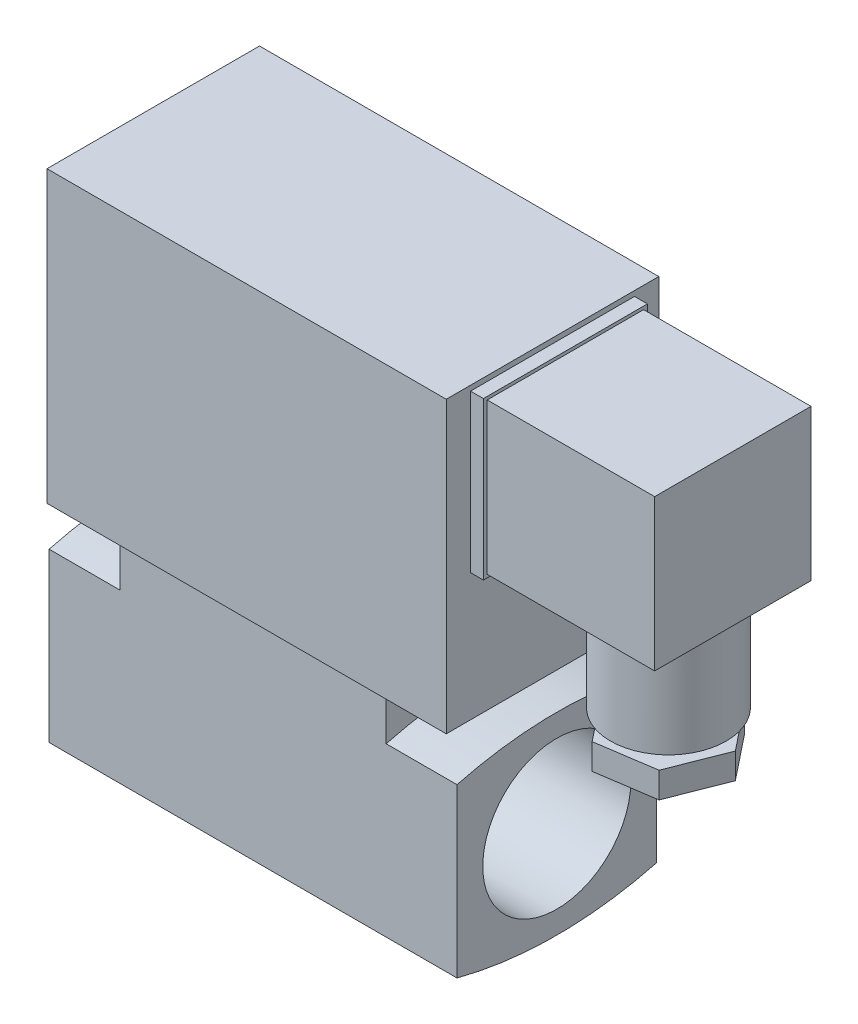
ISO-10303-21;
HEADER;
FILE_DESCRIPTION(('STEP AP214'),'2;1');
FILE_NAME('part.step','',(''),(''),'','','');
FILE_SCHEMA(('AUTOMOTIVE_DESIGN { 1 0 10303 214 1 1 1 1 }'));
ENDSEC;
DATA;
#1=APPLICATION_CONTEXT('core data for automotive mechanical design processes');
#2=APPLICATION_PROTOCOL_DEFINITION('international standard','automotive_design',2000,#1);
#3=PRODUCT_CONTEXT('',#1,'mechanical');
#4=PRODUCT('Part','Part','',(#3));
#5=PRODUCT_RELATED_PRODUCT_CATEGORY('part','',(#4));
#6=PRODUCT_DEFINITION_FORMATION('','',#4);
#7=PRODUCT_DEFINITION_CONTEXT('part definition',#1,'design');
#8=PRODUCT_DEFINITION('design','',#6,#7);
#9=PRODUCT_DEFINITION_SHAPE('','',#8);
#10=(LENGTH_UNIT() NAMED_UNIT(*) SI_UNIT(.MILLI.,.METRE.));
#11=(NAMED_UNIT(*) PLANE_ANGLE_UNIT() SI_UNIT($,.RADIAN.));
#12=(NAMED_UNIT(*) SI_UNIT($,.STERADIAN.) SOLID_ANGLE_UNIT());
#13=UNCERTAINTY_MEASURE_WITH_UNIT(LENGTH_MEASURE(1.E-05),#10,'distance_accuracy_value','');
#14=(GEOMETRIC_REPRESENTATION_CONTEXT(3) GLOBAL_UNCERTAINTY_ASSIGNED_CONTEXT((#13)) GLOBAL_UNIT_ASSIGNED_CONTEXT((#10,
#11,#12)) REPRESENTATION_CONTEXT('',''));
#15=CARTESIAN_POINT('',(0.,0.,0.));
#16=DIRECTION('',(0.,0.,1.));
#17=DIRECTION('',(1.,0.,0.));
#18=AXIS2_PLACEMENT_3D('',#15,#16,#17);
#19=CARTESIAN_POINT('',(-0.666821955000382,0.,0.));
#20=DIRECTION('',(1.,0.,0.));
#21=DIRECTION('',(0.,0.,-1.));
#22=AXIS2_PLACEMENT_3D('',#19,#20,#21);
#23=PLANE('',#22);
#24=CARTESIAN_POINT('',(-0.666821955000382,-65.,16.5));
#25=DIRECTION('',(1.,0.,0.));
#26=DIRECTION('',(0.,0.,-1.));
#27=AXIS2_PLACEMENT_3D('',#24,#25,#26);
#28=CIRCLE('',#27,11.5);
#29=CARTESIAN_POINT('',(-0.666821955000382,-65.,5.00000000000001));
#30=VERTEX_POINT('',#29);
#31=EDGE_CURVE('E786',#30,#30,#28,.F.);
#32=ORIENTED_EDGE('',*,*,#31,.F.);
#33=EDGE_LOOP('',(#32));
#34=FACE_BOUND('',#33,.T.);
#35=DIRECTION('',(0.,1.,0.));
#36=VECTOR('',#35,1.);
#37=CARTESIAN_POINT('',(-0.666821955000382,-80.,32.));
#38=LINE('',#37,#36);
#39=CARTESIAN_POINT('',(-0.666821955000382,-78.,32.));
#40=VERTEX_POINT('',#39);
#41=CARTESIAN_POINT('',(-0.666821955000382,-52.,32.));
#42=VERTEX_POINT('',#41);
#43=EDGE_CURVE('E280',#40,#42,#38,.T.);
#44=ORIENTED_EDGE('',*,*,#43,.T.);
#45=CARTESIAN_POINT('',(-0.666821955000382,-111.0625,16.5));
#46=DIRECTION('',(1.,0.,0.));
#47=DIRECTION('',(0.,0.,1.));
#48=AXIS2_PLACEMENT_3D('',#45,#46,#47);
#49=CIRCLE('',#48,61.0624999999997);
#50=CARTESIAN_POINT('',(-0.666821955000382,-52.,1.00000000000001));
#51=VERTEX_POINT('',#50);
#52=EDGE_CURVE('E249',#51,#42,#49,.T.);
#53=ORIENTED_EDGE('',*,*,#52,.F.);
#54=DIRECTION('',(0.,-1.,0.));
#55=VECTOR('',#54,1.);
#56=CARTESIAN_POINT('',(-0.666821955000382,-80.,1.00000000000001));
#57=LINE('',#56,#55);
#58=CARTESIAN_POINT('',(-0.666821955000382,-78.,1.00000000000002));
#59=VERTEX_POINT('',#58);
#60=EDGE_CURVE('E277',#51,#59,#57,.T.);
#61=ORIENTED_EDGE('',*,*,#60,.T.);
#62=CARTESIAN_POINT('',(-0.666821955000382,-18.937499999999,16.5));
#63=DIRECTION('',(1.,0.,0.));
#64=DIRECTION('',(0.,0.,-1.));
#65=AXIS2_PLACEMENT_3D('',#62,#63,#64);
#66=CIRCLE('',#65,61.062500000001);
#67=EDGE_CURVE('E260',#40,#59,#66,.T.);
#68=ORIENTED_EDGE('',*,*,#67,.F.);
#69=EDGE_LOOP('',(#44,#53,#61,#68));
#70=FACE_BOUND('',#69,.T.);
#71=ADVANCED_FACE('F35',(#34,#70),#23,.F.);
#72=CARTESIAN_POINT('',(62.6668219550004,0.,0.));
#73=DIRECTION('',(-1.,0.,0.));
#74=DIRECTION('',(0.,0.,1.));
#75=AXIS2_PLACEMENT_3D('',#72,#73,#74);
#76=PLANE('',#75);
#77=CARTESIAN_POINT('',(62.6668219550004,-65.,16.5));
#78=DIRECTION('',(1.,0.,0.));
#79=DIRECTION('',(0.,0.,-1.));
#80=AXIS2_PLACEMENT_3D('',#77,#78,#79);
#81=CIRCLE('',#80,11.5);
#82=CARTESIAN_POINT('',(62.6668219550004,-65.,5.00000000000001));
#83=VERTEX_POINT('',#82);
#84=EDGE_CURVE('E789',#83,#83,#81,.T.);
#85=ORIENTED_EDGE('',*,*,#84,.F.);
#86=EDGE_LOOP('',(#85));
#87=FACE_BOUND('',#86,.T.);
#88=DIRECTION('',(0.,1.,0.));
#89=VECTOR('',#88,1.);
#90=CARTESIAN_POINT('',(62.6668219550004,-80.,1.00000000000001));
#91=LINE('',#90,#89);
#92=CARTESIAN_POINT('',(62.6668219550004,-78.,1.00000000000001));
#93=VERTEX_POINT('',#92);
#94=CARTESIAN_POINT('',(62.6668219550004,-52.,1.00000000000001));
#95=VERTEX_POINT('',#94);
#96=EDGE_CURVE('E285',#93,#95,#91,.T.);
#97=ORIENTED_EDGE('',*,*,#96,.T.);
#98=CARTESIAN_POINT('',(62.6668219550004,-111.0625,16.5));
#99=DIRECTION('',(-1.,0.,0.));
#100=DIRECTION('',(0.,0.,-1.));
#101=AXIS2_PLACEMENT_3D('',#98,#99,#100);
#102=CIRCLE('',#101,61.0624999999999);
#103=CARTESIAN_POINT('',(62.6668219550004,-52.,32.));
#104=VERTEX_POINT('',#103);
#105=EDGE_CURVE('E263',#104,#95,#102,.T.);
#106=ORIENTED_EDGE('',*,*,#105,.F.);
#107=DIRECTION('',(0.,-1.,0.));
#108=VECTOR('',#107,1.);
#109=CARTESIAN_POINT('',(62.6668219550004,-80.,32.));
#110=LINE('',#109,#108);
#111=CARTESIAN_POINT('',(62.6668219550004,-78.,32.));
#112=VERTEX_POINT('',#111);
#113=EDGE_CURVE('E283',#104,#112,#110,.T.);
#114=ORIENTED_EDGE('',*,*,#113,.T.);
#115=CARTESIAN_POINT('',(62.6668219550004,-18.9374999999993,16.5));
#116=DIRECTION('',(-1.,0.,0.));
#117=DIRECTION('',(0.,0.,1.));
#118=AXIS2_PLACEMENT_3D('',#115,#116,#117);
#119=CIRCLE('',#118,61.0625000000007);
#120=EDGE_CURVE('E43',#112,#93,#119,.F.);
#121=ORIENTED_EDGE('',*,*,#120,.T.);
#122=EDGE_LOOP('',(#97,#106,#114,#121));
#123=FACE_BOUND('',#122,.T.);
#124=ADVANCED_FACE('F434',(#87,#123),#76,.F.);
#125=CARTESIAN_POINT('',(10.3331780449996,-80.,1.00000000000001));
#126=DIRECTION('',(1.,0.,0.));
#127=DIRECTION('',(0.,0.,-1.));
#128=AXIS2_PLACEMENT_3D('',#125,#126,#127);
#129=PLANE('',#128);
#130=DIRECTION('',(0.,1.,0.));
#131=VECTOR('',#130,1.);
#132=CARTESIAN_POINT('',(10.3331780449996,-80.,32.));
#133=LINE('',#132,#131);
#134=CARTESIAN_POINT('',(10.3331780449996,-52.,32.));
#135=VERTEX_POINT('',#134);
#136=CARTESIAN_POINT('',(10.3331780449996,-45.,32.));
#137=VERTEX_POINT('',#136);
#138=EDGE_CURVE('E302',#135,#137,#133,.T.);
#139=ORIENTED_EDGE('',*,*,#138,.T.);
#140=DIRECTION('',(0.,0.,-1.));
#141=VECTOR('',#140,1.);
#142=CARTESIAN_POINT('',(10.3331780449996,-45.,1.00000000000001));
#143=LINE('',#142,#141);
#144=CARTESIAN_POINT('',(10.3331780449996,-45.,1.00000000000001));
#145=VERTEX_POINT('',#144);
#146=EDGE_CURVE('E292',#137,#145,#143,.T.);
#147=ORIENTED_EDGE('',*,*,#146,.T.);
#148=DIRECTION('',(0.,1.,0.));
#149=VECTOR('',#148,1.);
#150=CARTESIAN_POINT('',(10.3331780449996,-80.,1.00000000000001));
#151=LINE('',#150,#149);
#152=CARTESIAN_POINT('',(10.3331780449996,-52.,1.00000000000002));
#153=VERTEX_POINT('',#152);
#154=EDGE_CURVE('E300',#153,#145,#151,.T.);
#155=ORIENTED_EDGE('',*,*,#154,.F.);
#156=CARTESIAN_POINT('',(10.3331780449996,-111.0625,16.5));
#157=DIRECTION('',(1.,0.,0.));
#158=DIRECTION('',(0.,0.,-1.));
#159=AXIS2_PLACEMENT_3D('',#156,#157,#158);
#160=CIRCLE('',#159,61.0624999999997);
#161=EDGE_CURVE('E252',#153,#135,#160,.T.);
#162=ORIENTED_EDGE('',*,*,#161,.T.);
#163=EDGE_LOOP('',(#139,#147,#155,#162));
#164=FACE_BOUND('',#163,.T.);
#165=ADVANCED_FACE('F440',(#164),#129,.F.);
#166=CARTESIAN_POINT('',(51.6668219550004,-80.,1.00000000000001));
#167=DIRECTION('',(-1.,0.,0.));
#168=DIRECTION('',(0.,0.,1.));
#169=AXIS2_PLACEMENT_3D('',#166,#167,#168);
#170=PLANE('',#169);
#171=DIRECTION('',(0.,0.,1.));
#172=VECTOR('',#171,1.);
#173=CARTESIAN_POINT('',(51.6668219550004,-45.,1.00000000000001));
#174=LINE('',#173,#172);
#175=CARTESIAN_POINT('',(51.6668219550004,-45.,1.00000000000001));
#176=VERTEX_POINT('',#175);
#177=CARTESIAN_POINT('',(51.6668219550004,-45.,32.));
#178=VERTEX_POINT('',#177);
#179=EDGE_CURVE('E287',#176,#178,#174,.T.);
#180=ORIENTED_EDGE('',*,*,#179,.T.);
#181=DIRECTION('',(0.,1.,0.));
#182=VECTOR('',#181,1.);
#183=CARTESIAN_POINT('',(51.6668219550004,-80.,32.));
#184=LINE('',#183,#182);
#185=CARTESIAN_POINT('',(51.6668219550004,-52.,32.));
#186=VERTEX_POINT('',#185);
#187=EDGE_CURVE('E57',#186,#178,#184,.T.);
#188=ORIENTED_EDGE('',*,*,#187,.F.);
#189=CARTESIAN_POINT('',(51.6668219550004,-111.0625,16.5));
#190=DIRECTION('',(-1.,0.,0.));
#191=DIRECTION('',(0.,0.,-1.));
#192=AXIS2_PLACEMENT_3D('',#189,#190,#191);
#193=CIRCLE('',#192,61.0624999999999);
#194=CARTESIAN_POINT('',(51.6668219550004,-52.,1.00000000000001));
#195=VERTEX_POINT('',#194);
#196=EDGE_CURVE('E264',#186,#195,#193,.T.);
#197=ORIENTED_EDGE('',*,*,#196,.T.);
#198=DIRECTION('',(0.,1.,0.));
#199=VECTOR('',#198,1.);
#200=CARTESIAN_POINT('',(51.6668219550004,-80.,1.00000000000001));
#201=LINE('',#200,#199);
#202=EDGE_CURVE('E298',#195,#176,#201,.T.);
#203=ORIENTED_EDGE('',*,*,#202,.T.);
#204=EDGE_LOOP('',(#180,#188,#197,#203));
#205=FACE_BOUND('',#204,.T.);
#206=ADVANCED_FACE('F456',(#205),#170,.F.);
#207=CARTESIAN_POINT('',(0.,-45.,33.));
#208=DIRECTION('',(0.,1.,0.));
#209=DIRECTION('',(0.,0.,1.));
#210=AXIS2_PLACEMENT_3D('',#207,#208,#209);
#211=PLANE('',#210);
#212=DIRECTION('',(1.,0.,0.));
#213=VECTOR('',#212,1.);
#214=CARTESIAN_POINT('',(0.,-45.,0.));
#215=LINE('',#214,#213);
#216=CARTESIAN_POINT('',(0.,-45.,0.));
#217=VERTEX_POINT('',#216);
#218=CARTESIAN_POINT('',(62.,-45.,0.));
#219=VERTEX_POINT('',#218);
#220=EDGE_CURVE('E385',#217,#219,#215,.T.);
#221=ORIENTED_EDGE('',*,*,#220,.T.);
#222=DIRECTION('',(0.,0.,-1.));
#223=VECTOR('',#222,1.);
#224=CARTESIAN_POINT('',(62.,-45.,33.));
#225=LINE('',#224,#223);
#226=CARTESIAN_POINT('',(62.,-45.,33.));
#227=VERTEX_POINT('',#226);
#228=EDGE_CURVE('E395',#227,#219,#225,.T.);
#229=ORIENTED_EDGE('',*,*,#228,.F.);
#230=DIRECTION('',(1.,0.,0.));
#231=VECTOR('',#230,1.);
#232=CARTESIAN_POINT('',(0.,-45.,33.));
#233=LINE('',#232,#231);
#234=CARTESIAN_POINT('',(0.,-45.,33.));
#235=VERTEX_POINT('',#234);
#236=EDGE_CURVE('E375',#235,#227,#233,.T.);
#237=ORIENTED_EDGE('',*,*,#236,.F.);
#238=DIRECTION('',(0.,0.,-1.));
#239=VECTOR('',#238,1.);
#240=CARTESIAN_POINT('',(0.,-45.,33.));
#241=LINE('',#240,#239);
#242=EDGE_CURVE('E398',#235,#217,#241,.T.);
#243=ORIENTED_EDGE('',*,*,#242,.T.);
#244=EDGE_LOOP('',(#221,#229,#237,#243));
#245=FACE_BOUND('',#244,.T.);
#246=ORIENTED_EDGE('',*,*,#179,.F.);
#247=DIRECTION('',(1.,0.,0.));
#248=VECTOR('',#247,1.);
#249=CARTESIAN_POINT('',(10.3331780449996,-45.,1.00000000000001));
#250=LINE('',#249,#248);
#251=EDGE_CURVE('E295',#145,#176,#250,.T.);
#252=ORIENTED_EDGE('',*,*,#251,.F.);
#253=ORIENTED_EDGE('',*,*,#146,.F.);
#254=DIRECTION('',(-1.,0.,0.));
#255=VECTOR('',#254,1.);
#256=CARTESIAN_POINT('',(10.3331780449996,-45.,32.));
#257=LINE('',#256,#255);
#258=EDGE_CURVE('E290',#178,#137,#257,.T.);
#259=ORIENTED_EDGE('',*,*,#258,.F.);
#260=EDGE_LOOP('',(#246,#252,#253,#259));
#261=FACE_BOUND('',#260,.T.);
#262=ADVANCED_FACE('F402',(#245,#261),#211,.F.);
#263=CARTESIAN_POINT('',(64.,0.,0.));
#264=DIRECTION('',(-1.,0.,0.));
#265=DIRECTION('',(0.,-1.,0.));
#266=AXIS2_PLACEMENT_3D('',#263,#264,#265);
#267=PLANE('',#266);
#268=DIRECTION('',(0.,1.,0.));
#269=VECTOR('',#268,1.);
#270=CARTESIAN_POINT('',(64.,-25.2053895963953,3.76803542840377));
#271=LINE('',#270,#269);
#272=CARTESIAN_POINT('',(64.,-25.2053895963953,3.76803542840377));
#273=VERTEX_POINT('',#272);
#274=CARTESIAN_POINT('',(64.,-0.794610403604666,3.76803542840377));
#275=VERTEX_POINT('',#274);
#276=EDGE_CURVE('E339',#273,#275,#271,.T.);
#277=ORIENTED_EDGE('',*,*,#276,.T.);
#278=DIRECTION('',(0.,0.,1.));
#279=VECTOR('',#278,1.);
#280=CARTESIAN_POINT('',(64.,-0.794610403604665,29.2319645715962));
#281=LINE('',#280,#279);
#282=CARTESIAN_POINT('',(64.,-0.794610403604665,29.2319645715962));
#283=VERTEX_POINT('',#282);
#284=EDGE_CURVE('E342',#275,#283,#281,.T.);
#285=ORIENTED_EDGE('',*,*,#284,.T.);
#286=DIRECTION('',(0.,-1.,0.));
#287=VECTOR('',#286,1.);
#288=CARTESIAN_POINT('',(64.,-25.2053895963953,29.2319645715962));
#289=LINE('',#288,#287);
#290=CARTESIAN_POINT('',(64.,-25.2053895963953,29.2319645715962));
#291=VERTEX_POINT('',#290);
#292=EDGE_CURVE('E345',#283,#291,#289,.T.);
#293=ORIENTED_EDGE('',*,*,#292,.T.);
#294=DIRECTION('',(0.,0.,-1.));
#295=VECTOR('',#294,1.);
#296=CARTESIAN_POINT('',(64.,-25.2053895963953,29.2319645715962));
#297=LINE('',#296,#295);
#298=EDGE_CURVE('E347',#291,#273,#297,.T.);
#299=ORIENTED_EDGE('',*,*,#298,.T.);
#300=EDGE_LOOP('',(#277,#285,#293,#299));
#301=FACE_BOUND('',#300,.T.);
#302=DIRECTION('',(0.,-1.,0.));
#303=VECTOR('',#302,1.);
#304=CARTESIAN_POINT('',(64.,-24.7218972708917,28.6410295070917));
#305=LINE('',#304,#303);
#306=CARTESIAN_POINT('',(64.,-1.27810272910831,28.6410295070917));
#307=VERTEX_POINT('',#306);
#308=CARTESIAN_POINT('',(64.,-24.7218972708917,28.6410295070917));
#309=VERTEX_POINT('',#308);
#310=EDGE_CURVE('E305',#307,#309,#305,.T.);
#311=ORIENTED_EDGE('',*,*,#310,.F.);
#312=DIRECTION('',(0.,0.,1.));
#313=VECTOR('',#312,1.);
#314=CARTESIAN_POINT('',(64.,-1.27810272910831,4.35897049290827));
#315=LINE('',#314,#313);
#316=CARTESIAN_POINT('',(64.,-1.27810272910831,4.35897049290827));
#317=VERTEX_POINT('',#316);
#318=EDGE_CURVE('E310',#317,#307,#315,.T.);
#319=ORIENTED_EDGE('',*,*,#318,.F.);
#320=DIRECTION('',(0.,1.,0.));
#321=VECTOR('',#320,1.);
#322=CARTESIAN_POINT('',(64.,-24.7218972708917,4.35897049290827));
#323=LINE('',#322,#321);
#324=CARTESIAN_POINT('',(64.,-24.7218972708917,4.35897049290827));
#325=VERTEX_POINT('',#324);
#326=EDGE_CURVE('E322',#325,#317,#323,.T.);
#327=ORIENTED_EDGE('',*,*,#326,.F.);
#328=DIRECTION('',(0.,0.,-1.));
#329=VECTOR('',#328,1.);
#330=CARTESIAN_POINT('',(64.,-24.7218972708917,4.35897049290827));
#331=LINE('',#330,#329);
#332=EDGE_CURVE('E319',#309,#325,#331,.T.);
#333=ORIENTED_EDGE('',*,*,#332,.F.);
#334=EDGE_LOOP('',(#311,#319,#327,#333));
#335=FACE_BOUND('',#334,.T.);
#336=ADVANCED_FACE('F484',(#301,#335),#267,.F.);
#337=CARTESIAN_POINT('',(62.,0.,33.));
#338=DIRECTION('',(-1.,0.,0.));
#339=DIRECTION('',(0.,-1.,0.));
#340=AXIS2_PLACEMENT_3D('',#337,#338,#339);
#341=PLANE('',#340);
#342=DIRECTION('',(0.,1.,0.));
#343=VECTOR('',#342,1.);
#344=CARTESIAN_POINT('',(62.,0.,0.));
#345=LINE('',#344,#343);
#346=CARTESIAN_POINT('',(62.,0.,0.));
#347=VERTEX_POINT('',#346);
#348=EDGE_CURVE('E387',#219,#347,#345,.T.);
#349=ORIENTED_EDGE('',*,*,#348,.T.);
#350=DIRECTION('',(0.,0.,-1.));
#351=VECTOR('',#350,1.);
#352=CARTESIAN_POINT('',(62.,0.,33.));
#353=LINE('',#352,#351);
#354=CARTESIAN_POINT('',(62.,0.,33.));
#355=VERTEX_POINT('',#354);
#356=EDGE_CURVE('E392',#355,#347,#353,.T.);
#357=ORIENTED_EDGE('',*,*,#356,.F.);
#358=DIRECTION('',(0.,1.,0.));
#359=VECTOR('',#358,1.);
#360=CARTESIAN_POINT('',(62.,0.,33.));
#361=LINE('',#360,#359);
#362=EDGE_CURVE('E378',#227,#355,#361,.T.);
#363=ORIENTED_EDGE('',*,*,#362,.F.);
#364=ORIENTED_EDGE('',*,*,#228,.T.);
#365=EDGE_LOOP('',(#349,#357,#363,#364));
#366=FACE_BOUND('',#365,.T.);
#367=DIRECTION('',(0.,1.,0.));
#368=VECTOR('',#367,1.);
#369=CARTESIAN_POINT('',(62.,-25.2053895963953,3.76803542840377));
#370=LINE('',#369,#368);
#371=CARTESIAN_POINT('',(62.,-25.2053895963953,3.76803542840377));
#372=VERTEX_POINT('',#371);
#373=CARTESIAN_POINT('',(62.,-0.794610403604667,3.76803542840377));
#374=VERTEX_POINT('',#373);
#375=EDGE_CURVE('E338',#372,#374,#370,.T.);
#376=ORIENTED_EDGE('',*,*,#375,.F.);
#377=DIRECTION('',(0.,0.,-1.));
#378=VECTOR('',#377,1.);
#379=CARTESIAN_POINT('',(62.,-25.2053895963953,29.2319645715962));
#380=LINE('',#379,#378);
#381=CARTESIAN_POINT('',(62.,-25.2053895963953,29.2319645715962));
#382=VERTEX_POINT('',#381);
#383=EDGE_CURVE('E343',#382,#372,#380,.T.);
#384=ORIENTED_EDGE('',*,*,#383,.F.);
#385=DIRECTION('',(0.,-1.,0.));
#386=VECTOR('',#385,1.);
#387=CARTESIAN_POINT('',(62.,-25.2053895963953,29.2319645715962));
#388=LINE('',#387,#386);
#389=CARTESIAN_POINT('',(62.,-0.794610403604665,29.2319645715962));
#390=VERTEX_POINT('',#389);
#391=EDGE_CURVE('E355',#390,#382,#388,.T.);
#392=ORIENTED_EDGE('',*,*,#391,.F.);
#393=DIRECTION('',(0.,0.,1.));
#394=VECTOR('',#393,1.);
#395=CARTESIAN_POINT('',(62.,-0.794610403604666,29.2319645715962));
#396=LINE('',#395,#394);
#397=EDGE_CURVE('E352',#374,#390,#396,.T.);
#398=ORIENTED_EDGE('',*,*,#397,.F.);
#399=EDGE_LOOP('',(#376,#384,#392,#398));
#400=FACE_BOUND('',#399,.T.);
#401=ADVANCED_FACE('F415',(#366,#400),#341,.F.);
#402=CARTESIAN_POINT('',(0.,0.,33.));
#403=DIRECTION('',(1.,0.,0.));
#404=DIRECTION('',(0.,1.,0.));
#405=AXIS2_PLACEMENT_3D('',#402,#403,#404);
#406=PLANE('',#405);
#407=DIRECTION('',(0.,-1.,0.));
#408=VECTOR('',#407,1.);
#409=CARTESIAN_POINT('',(0.,0.,0.));
#410=LINE('',#409,#408);
#411=CARTESIAN_POINT('',(0.,0.,0.));
#412=VERTEX_POINT('',#411);
#413=EDGE_CURVE('E371',#412,#217,#410,.T.);
#414=ORIENTED_EDGE('',*,*,#413,.T.);
#415=ORIENTED_EDGE('',*,*,#242,.F.);
#416=DIRECTION('',(0.,-1.,0.));
#417=VECTOR('',#416,1.);
#418=CARTESIAN_POINT('',(0.,0.,33.));
#419=LINE('',#418,#417);
#420=CARTESIAN_POINT('',(0.,0.,33.));
#421=VERTEX_POINT('',#420);
#422=EDGE_CURVE('E372',#421,#235,#419,.T.);
#423=ORIENTED_EDGE('',*,*,#422,.F.);
#424=DIRECTION('',(0.,0.,-1.));
#425=VECTOR('',#424,1.);
#426=CARTESIAN_POINT('',(0.,0.,33.));
#427=LINE('',#426,#425);
#428=EDGE_CURVE('E382',#421,#412,#427,.T.);
#429=ORIENTED_EDGE('',*,*,#428,.T.);
#430=EDGE_LOOP('',(#414,#415,#423,#429));
#431=FACE_BOUND('',#430,.T.);
#432=ADVANCED_FACE('F37',(#431),#406,.F.);
#433=CARTESIAN_POINT('',(0.,0.,33.));
#434=DIRECTION('',(0.,-1.,0.));
#435=DIRECTION('',(0.,0.,-1.));
#436=AXIS2_PLACEMENT_3D('',#433,#434,#435);
#437=PLANE('',#436);
#438=DIRECTION('',(-1.,0.,0.));
#439=VECTOR('',#438,1.);
#440=CARTESIAN_POINT('',(0.,0.,0.));
#441=LINE('',#440,#439);
#442=EDGE_CURVE('E376',#347,#412,#441,.T.);
#443=ORIENTED_EDGE('',*,*,#442,.T.);
#444=ORIENTED_EDGE('',*,*,#428,.F.);
#445=DIRECTION('',(-1.,0.,0.));
#446=VECTOR('',#445,1.);
#447=CARTESIAN_POINT('',(0.,0.,33.));
#448=LINE('',#447,#446);
#449=EDGE_CURVE('E380',#355,#421,#448,.T.);
#450=ORIENTED_EDGE('',*,*,#449,.F.);
#451=ORIENTED_EDGE('',*,*,#356,.T.);
#452=EDGE_LOOP('',(#443,#444,#450,#451));
#453=FACE_BOUND('',#452,.T.);
#454=ADVANCED_FACE('F420',(#453),#437,.F.);
#455=CARTESIAN_POINT('',(0.,0.,33.));
#456=DIRECTION('',(0.,0.,1.));
#457=DIRECTION('',(1.,0.,0.));
#458=AXIS2_PLACEMENT_3D('',#455,#456,#457);
#459=PLANE('',#458);
#460=ORIENTED_EDGE('',*,*,#422,.T.);
#461=ORIENTED_EDGE('',*,*,#236,.T.);
#462=ORIENTED_EDGE('',*,*,#362,.T.);
#463=ORIENTED_EDGE('',*,*,#449,.T.);
#464=EDGE_LOOP('',(#460,#461,#462,#463));
#465=FACE_BOUND('',#464,.T.);
#466=ADVANCED_FACE('F422',(#465),#459,.T.);
#467=CARTESIAN_POINT('',(0.,0.,0.));
#468=DIRECTION('',(0.,0.,1.));
#469=DIRECTION('',(1.,0.,0.));
#470=AXIS2_PLACEMENT_3D('',#467,#468,#469);
#471=PLANE('',#470);
#472=ORIENTED_EDGE('',*,*,#413,.F.);
#473=ORIENTED_EDGE('',*,*,#442,.F.);
#474=ORIENTED_EDGE('',*,*,#348,.F.);
#475=ORIENTED_EDGE('',*,*,#220,.F.);
#476=EDGE_LOOP('',(#472,#473,#474,#475));
#477=FACE_BOUND('',#476,.T.);
#478=ADVANCED_FACE('F411',(#477),#471,.F.);
#479=CARTESIAN_POINT('',(64.,-25.2053895963953,3.76803542840377));
#480=DIRECTION('',(0.,0.,1.));
#481=DIRECTION('',(1.,0.,0.));
#482=AXIS2_PLACEMENT_3D('',#479,#480,#481);
#483=PLANE('',#482);
#484=ORIENTED_EDGE('',*,*,#375,.T.);
#485=DIRECTION('',(-1.,0.,0.));
#486=VECTOR('',#485,1.);
#487=CARTESIAN_POINT('',(64.,-0.794610403604666,3.76803542840377));
#488=LINE('',#487,#486);
#489=EDGE_CURVE('E368',#275,#374,#488,.T.);
#490=ORIENTED_EDGE('',*,*,#489,.F.);
#491=ORIENTED_EDGE('',*,*,#276,.F.);
#492=DIRECTION('',(-1.,0.,0.));
#493=VECTOR('',#492,1.);
#494=CARTESIAN_POINT('',(64.,-25.2053895963953,3.76803542840377));
#495=LINE('',#494,#493);
#496=EDGE_CURVE('E349',#273,#372,#495,.T.);
#497=ORIENTED_EDGE('',*,*,#496,.T.);
#498=EDGE_LOOP('',(#484,#490,#491,#497));
#499=FACE_BOUND('',#498,.T.);
#500=ADVANCED_FACE('F429',(#499),#483,.F.);
#501=CARTESIAN_POINT('',(64.,-0.794610403604665,29.2319645715962));
#502=DIRECTION('',(0.,-1.,0.));
#503=DIRECTION('',(1.,0.,0.));
#504=AXIS2_PLACEMENT_3D('',#501,#502,#503);
#505=PLANE('',#504);
#506=ORIENTED_EDGE('',*,*,#397,.T.);
#507=DIRECTION('',(-1.,0.,0.));
#508=VECTOR('',#507,1.);
#509=CARTESIAN_POINT('',(64.,-0.794610403604665,29.2319645715962));
#510=LINE('',#509,#508);
#511=EDGE_CURVE('E365',#283,#390,#510,.T.);
#512=ORIENTED_EDGE('',*,*,#511,.F.);
#513=ORIENTED_EDGE('',*,*,#284,.F.);
#514=ORIENTED_EDGE('',*,*,#489,.T.);
#515=EDGE_LOOP('',(#506,#512,#513,#514));
#516=FACE_BOUND('',#515,.T.);
#517=ADVANCED_FACE('F494',(#516),#505,.F.);
#518=CARTESIAN_POINT('',(64.,-25.2053895963953,29.2319645715962));
#519=DIRECTION('',(0.,0.,-1.));
#520=DIRECTION('',(-1.,0.,0.));
#521=AXIS2_PLACEMENT_3D('',#518,#519,#520);
#522=PLANE('',#521);
#523=ORIENTED_EDGE('',*,*,#391,.T.);
#524=DIRECTION('',(-1.,0.,0.));
#525=VECTOR('',#524,1.);
#526=CARTESIAN_POINT('',(64.,-25.2053895963953,29.2319645715962));
#527=LINE('',#526,#525);
#528=EDGE_CURVE('E362',#291,#382,#527,.T.);
#529=ORIENTED_EDGE('',*,*,#528,.F.);
#530=ORIENTED_EDGE('',*,*,#292,.F.);
#531=ORIENTED_EDGE('',*,*,#511,.T.);
#532=EDGE_LOOP('',(#523,#529,#530,#531));
#533=FACE_BOUND('',#532,.T.);
#534=ADVANCED_FACE('F490',(#533),#522,.F.);
#535=CARTESIAN_POINT('',(64.,-25.2053895963953,29.2319645715962));
#536=DIRECTION('',(0.,1.,0.));
#537=DIRECTION('',(-1.,0.,0.));
#538=AXIS2_PLACEMENT_3D('',#535,#536,#537);
#539=PLANE('',#538);
#540=ORIENTED_EDGE('',*,*,#383,.T.);
#541=ORIENTED_EDGE('',*,*,#496,.F.);
#542=ORIENTED_EDGE('',*,*,#298,.F.);
#543=ORIENTED_EDGE('',*,*,#528,.T.);
#544=EDGE_LOOP('',(#540,#541,#542,#543));
#545=FACE_BOUND('',#544,.T.);
#546=ADVANCED_FACE('F482',(#545),#539,.F.);
#547=CARTESIAN_POINT('',(90.,-24.7218972708917,28.6410295070917));
#548=DIRECTION('',(0.,0.,-1.));
#549=DIRECTION('',(-1.,0.,0.));
#550=AXIS2_PLACEMENT_3D('',#547,#548,#549);
#551=PLANE('',#550);
#552=ORIENTED_EDGE('',*,*,#310,.T.);
#553=DIRECTION('',(-1.,0.,0.));
#554=VECTOR('',#553,1.);
#555=CARTESIAN_POINT('',(90.,-24.7218972708917,28.6410295070917));
#556=LINE('',#555,#554);
#557=CARTESIAN_POINT('',(90.,-24.7218972708917,28.6410295070917));
#558=VERTEX_POINT('',#557);
#559=EDGE_CURVE('E335',#558,#309,#556,.T.);
#560=ORIENTED_EDGE('',*,*,#559,.F.);
#561=DIRECTION('',(0.,-1.,0.));
#562=VECTOR('',#561,1.);
#563=CARTESIAN_POINT('',(90.,-24.7218972708917,28.6410295070917));
#564=LINE('',#563,#562);
#565=CARTESIAN_POINT('',(90.,-1.2781027291083,28.6410295070917));
#566=VERTEX_POINT('',#565);
#567=EDGE_CURVE('E306',#566,#558,#564,.T.);
#568=ORIENTED_EDGE('',*,*,#567,.F.);
#569=DIRECTION('',(-1.,0.,0.));
#570=VECTOR('',#569,1.);
#571=CARTESIAN_POINT('',(90.,-1.2781027291083,28.6410295070917));
#572=LINE('',#571,#570);
#573=EDGE_CURVE('E316',#566,#307,#572,.T.);
#574=ORIENTED_EDGE('',*,*,#573,.T.);
#575=EDGE_LOOP('',(#552,#560,#568,#574));
#576=FACE_BOUND('',#575,.T.);
#577=ADVANCED_FACE('F478',(#576),#551,.F.);
#578=CARTESIAN_POINT('',(90.,-24.7218972708917,4.35897049290827));
#579=DIRECTION('',(0.,1.,0.));
#580=DIRECTION('',(0.,0.,1.));
#581=AXIS2_PLACEMENT_3D('',#578,#579,#580);
#582=PLANE('',#581);
#583=CARTESIAN_POINT('',(80.,-24.7218972708917,16.5));
#584=DIRECTION('',(0.,1.,0.));
#585=DIRECTION('',(0.,0.,1.));
#586=AXIS2_PLACEMENT_3D('',#583,#584,#585);
#587=CIRCLE('',#586,9.);
#588=CARTESIAN_POINT('',(80.,-24.7218972708917,25.5));
#589=VERTEX_POINT('',#588);
#590=EDGE_CURVE('E11',#589,#589,#587,.F.);
#591=ORIENTED_EDGE('',*,*,#590,.F.);
#592=EDGE_LOOP('',(#591));
#593=FACE_BOUND('',#592,.T.);
#594=ORIENTED_EDGE('',*,*,#332,.T.);
#595=DIRECTION('',(-1.,0.,0.));
#596=VECTOR('',#595,1.);
#597=CARTESIAN_POINT('',(90.,-24.7218972708917,4.35897049290827));
#598=LINE('',#597,#596);
#599=CARTESIAN_POINT('',(90.,-24.7218972708917,4.35897049290827));
#600=VERTEX_POINT('',#599);
#601=EDGE_CURVE('E332',#600,#325,#598,.T.);
#602=ORIENTED_EDGE('',*,*,#601,.F.);
#603=DIRECTION('',(0.,0.,-1.));
#604=VECTOR('',#603,1.);
#605=CARTESIAN_POINT('',(90.,-24.7218972708917,4.35897049290827));
#606=LINE('',#605,#604);
#607=EDGE_CURVE('E309',#558,#600,#606,.T.);
#608=ORIENTED_EDGE('',*,*,#607,.F.);
#609=ORIENTED_EDGE('',*,*,#559,.T.);
#610=EDGE_LOOP('',(#594,#602,#608,#609));
#611=FACE_BOUND('',#610,.T.);
#612=ADVANCED_FACE('F474',(#593,#611),#582,.F.);
#613=CARTESIAN_POINT('',(90.,-24.7218972708917,4.35897049290827));
#614=DIRECTION('',(0.,0.,1.));
#615=DIRECTION('',(1.,0.,0.));
#616=AXIS2_PLACEMENT_3D('',#613,#614,#615);
#617=PLANE('',#616);
#618=ORIENTED_EDGE('',*,*,#326,.T.);
#619=DIRECTION('',(-1.,0.,0.));
#620=VECTOR('',#619,1.);
#621=CARTESIAN_POINT('',(90.,-1.2781027291083,4.35897049290827));
#622=LINE('',#621,#620);
#623=CARTESIAN_POINT('',(90.,-1.2781027291083,4.35897049290827));
#624=VERTEX_POINT('',#623);
#625=EDGE_CURVE('E329',#624,#317,#622,.T.);
#626=ORIENTED_EDGE('',*,*,#625,.F.);
#627=DIRECTION('',(0.,1.,0.));
#628=VECTOR('',#627,1.);
#629=CARTESIAN_POINT('',(90.,-24.7218972708917,4.35897049290827));
#630=LINE('',#629,#628);
#631=EDGE_CURVE('E312',#600,#624,#630,.T.);
#632=ORIENTED_EDGE('',*,*,#631,.F.);
#633=ORIENTED_EDGE('',*,*,#601,.T.);
#634=EDGE_LOOP('',(#618,#626,#632,#633));
#635=FACE_BOUND('',#634,.T.);
#636=ADVANCED_FACE('F470',(#635),#617,.F.);
#637=CARTESIAN_POINT('',(90.,-1.2781027291083,4.35897049290827));
#638=DIRECTION('',(0.,-1.,0.));
#639=DIRECTION('',(1.,0.,0.));
#640=AXIS2_PLACEMENT_3D('',#637,#638,#639);
#641=PLANE('',#640);
#642=ORIENTED_EDGE('',*,*,#318,.T.);
#643=ORIENTED_EDGE('',*,*,#573,.F.);
#644=DIRECTION('',(0.,0.,1.));
#645=VECTOR('',#644,1.);
#646=CARTESIAN_POINT('',(90.,-1.2781027291083,4.35897049290827));
#647=LINE('',#646,#645);
#648=EDGE_CURVE('E314',#624,#566,#647,.T.);
#649=ORIENTED_EDGE('',*,*,#648,.F.);
#650=ORIENTED_EDGE('',*,*,#625,.T.);
#651=EDGE_LOOP('',(#642,#643,#649,#650));
#652=FACE_BOUND('',#651,.T.);
#653=ADVANCED_FACE('F466',(#652),#641,.F.);
#654=CARTESIAN_POINT('',(90.,0.,0.));
#655=DIRECTION('',(1.,0.,0.));
#656=DIRECTION('',(0.,1.,0.));
#657=AXIS2_PLACEMENT_3D('',#654,#655,#656);
#658=PLANE('',#657);
#659=ORIENTED_EDGE('',*,*,#567,.T.);
#660=ORIENTED_EDGE('',*,*,#607,.T.);
#661=ORIENTED_EDGE('',*,*,#631,.T.);
#662=ORIENTED_EDGE('',*,*,#648,.T.);
#663=EDGE_LOOP('',(#659,#660,#661,#662));
#664=FACE_BOUND('',#663,.T.);
#665=ADVANCED_FACE('F460',(#664),#658,.T.);
#666=CARTESIAN_POINT('',(10.3331780449996,-80.,32.));
#667=DIRECTION('',(0.,0.,-1.));
#668=DIRECTION('',(-1.,0.,0.));
#669=AXIS2_PLACEMENT_3D('',#666,#667,#668);
#670=PLANE('',#669);
#671=ORIENTED_EDGE('',*,*,#138,.F.);
#672=DIRECTION('',(-1.,0.,0.));
#673=VECTOR('',#672,1.);
#674=CARTESIAN_POINT('',(45.9791482042077,-52.,32.));
#675=LINE('',#674,#673);
#676=EDGE_CURVE('E255',#135,#42,#675,.T.);
#677=ORIENTED_EDGE('',*,*,#676,.T.);
#678=ORIENTED_EDGE('',*,*,#43,.F.);
#679=DIRECTION('',(1.,0.,0.));
#680=VECTOR('',#679,1.);
#681=CARTESIAN_POINT('',(51.6668219550004,-78.,32.));
#682=LINE('',#681,#680);
#683=EDGE_CURVE('E274',#40,#112,#682,.T.);
#684=ORIENTED_EDGE('',*,*,#683,.T.);
#685=ORIENTED_EDGE('',*,*,#113,.F.);
#686=DIRECTION('',(1.,0.,0.));
#687=VECTOR('',#686,1.);
#688=CARTESIAN_POINT('',(51.6668219550004,-52.,32.));
#689=LINE('',#688,#687);
#690=EDGE_CURVE('E267',#186,#104,#689,.T.);
#691=ORIENTED_EDGE('',*,*,#690,.F.);
#692=ORIENTED_EDGE('',*,*,#187,.T.);
#693=ORIENTED_EDGE('',*,*,#258,.T.);
#694=EDGE_LOOP('',(#671,#677,#678,#684,#685,#691,#692,#693));
#695=FACE_BOUND('',#694,.T.);
#696=ADVANCED_FACE('F452',(#695),#670,.F.);
#697=CARTESIAN_POINT('',(10.3331780449996,-80.,1.00000000000001));
#698=DIRECTION('',(0.,0.,1.));
#699=DIRECTION('',(1.,0.,0.));
#700=AXIS2_PLACEMENT_3D('',#697,#698,#699);
#701=PLANE('',#700);
#702=DIRECTION('',(-1.,0.,0.));
#703=VECTOR('',#702,1.);
#704=CARTESIAN_POINT('',(45.9791482042077,-52.,1.00000000000001));
#705=LINE('',#704,#703);
#706=EDGE_CURVE('E251',#153,#51,#705,.T.);
#707=ORIENTED_EDGE('',*,*,#706,.F.);
#708=ORIENTED_EDGE('',*,*,#154,.T.);
#709=ORIENTED_EDGE('',*,*,#251,.T.);
#710=ORIENTED_EDGE('',*,*,#202,.F.);
#711=DIRECTION('',(1.,0.,0.));
#712=VECTOR('',#711,1.);
#713=CARTESIAN_POINT('',(51.6668219550004,-52.,1.00000000000001));
#714=LINE('',#713,#712);
#715=EDGE_CURVE('E269',#195,#95,#714,.T.);
#716=ORIENTED_EDGE('',*,*,#715,.T.);
#717=ORIENTED_EDGE('',*,*,#96,.F.);
#718=DIRECTION('',(1.,0.,0.));
#719=VECTOR('',#718,1.);
#720=CARTESIAN_POINT('',(51.6668219550004,-78.,1.00000000000003));
#721=LINE('',#720,#719);
#722=EDGE_CURVE('E272',#59,#93,#721,.T.);
#723=ORIENTED_EDGE('',*,*,#722,.F.);
#724=ORIENTED_EDGE('',*,*,#60,.F.);
#725=EDGE_LOOP('',(#707,#708,#709,#710,#716,#717,#723,#724));
#726=FACE_BOUND('',#725,.T.);
#727=ADVANCED_FACE('F449',(#726),#701,.F.);
#728=CARTESIAN_POINT('',(51.6668219550004,-18.9374999999993,16.5));
#729=DIRECTION('',(1.,0.,0.));
#730=DIRECTION('',(0.,0.,-1.));
#731=AXIS2_PLACEMENT_3D('',#728,#729,#730);
#732=CYLINDRICAL_SURFACE('',#731,61.0625000000007);
#733=ORIENTED_EDGE('',*,*,#67,.T.);
#734=ORIENTED_EDGE('',*,*,#722,.T.);
#735=ORIENTED_EDGE('',*,*,#120,.F.);
#736=ORIENTED_EDGE('',*,*,#683,.F.);
#737=EDGE_LOOP('',(#733,#734,#735,#736));
#738=FACE_BOUND('',#737,.T.);
#739=ADVANCED_FACE('F446',(#738),#732,.T.);
#740=CARTESIAN_POINT('',(51.6668219550004,-111.0625,16.5));
#741=DIRECTION('',(1.,0.,0.));
#742=DIRECTION('',(0.,0.,-1.));
#743=AXIS2_PLACEMENT_3D('',#740,#741,#742);
#744=CYLINDRICAL_SURFACE('',#743,61.0624999999999);
#745=ORIENTED_EDGE('',*,*,#105,.T.);
#746=ORIENTED_EDGE('',*,*,#715,.F.);
#747=ORIENTED_EDGE('',*,*,#196,.F.);
#748=ORIENTED_EDGE('',*,*,#690,.T.);
#749=EDGE_LOOP('',(#745,#746,#747,#748));
#750=FACE_BOUND('',#749,.T.);
#751=ADVANCED_FACE('F580',(#750),#744,.T.);
#752=CARTESIAN_POINT('',(45.9791482042077,-111.0625,16.5));
#753=DIRECTION('',(-1.,0.,0.));
#754=DIRECTION('',(0.,0.,1.));
#755=AXIS2_PLACEMENT_3D('',#752,#753,#754);
#756=CYLINDRICAL_SURFACE('',#755,61.0624999999997);
#757=ORIENTED_EDGE('',*,*,#52,.T.);
#758=ORIENTED_EDGE('',*,*,#676,.F.);
#759=ORIENTED_EDGE('',*,*,#161,.F.);
#760=ORIENTED_EDGE('',*,*,#706,.T.);
#761=EDGE_LOOP('',(#757,#758,#759,#760));
#762=FACE_BOUND('',#761,.T.);
#763=ADVANCED_FACE('F588',(#762),#756,.T.);
#764=CARTESIAN_POINT('',(80.,-40.7218972708917,16.5));
#765=DIRECTION('',(0.,1.,0.));
#766=DIRECTION('',(-1.,0.,0.));
#767=AXIS2_PLACEMENT_3D('',#764,#765,#766);
#768=CYLINDRICAL_SURFACE('',#767,9.);
#769=CARTESIAN_POINT('',(80.,-40.7218972708917,16.5));
#770=DIRECTION('',(0.,-1.,0.));
#771=DIRECTION('',(1.,0.,0.));
#772=AXIS2_PLACEMENT_3D('',#769,#770,#771);
#773=CIRCLE('',#772,9.);
#774=CARTESIAN_POINT('',(89.,-40.7218972708917,16.5));
#775=VERTEX_POINT('',#774);
#776=EDGE_CURVE('E245',#775,#775,#773,.T.);
#777=ORIENTED_EDGE('',*,*,#776,.F.);
#778=EDGE_LOOP('',(#777));
#779=FACE_BOUND('',#778,.T.);
#780=ORIENTED_EDGE('',*,*,#590,.T.);
#781=EDGE_LOOP('',(#780));
#782=FACE_BOUND('',#781,.T.);
#783=ADVANCED_FACE('F595',(#779,#782),#768,.T.);
#784=CARTESIAN_POINT('',(80.,-40.7218972708917,16.5));
#785=DIRECTION('',(0.,-1.,0.));
#786=DIRECTION('',(1.,0.,0.));
#787=AXIS2_PLACEMENT_3D('',#784,#785,#786);
#788=PLANE('',#787);
#789=CARTESIAN_POINT('',(80.,-40.7218972708917,16.5));
#790=DIRECTION('',(0.,-1.,0.));
#791=DIRECTION('',(1.,0.,0.));
#792=AXIS2_PLACEMENT_3D('',#789,#790,#791);
#793=CIRCLE('',#792,5.62520559571872);
#794=CARTESIAN_POINT('',(85.6252055957187,-40.7218972708917,16.5));
#795=VERTEX_POINT('',#794);
#796=EDGE_CURVE('E235',#795,#795,#793,.T.);
#797=ORIENTED_EDGE('',*,*,#796,.F.);
#798=EDGE_LOOP('',(#797));
#799=FACE_BOUND('',#798,.T.);
#800=ORIENTED_EDGE('',*,*,#776,.T.);
#801=EDGE_LOOP('',(#800));
#802=FACE_BOUND('',#801,.T.);
#803=ADVANCED_FACE('F604',(#799,#802),#788,.T.);
#804=CARTESIAN_POINT('',(80.,-42.7218972708917,16.5));
#805=DIRECTION('',(0.,1.,0.));
#806=DIRECTION('',(-1.,0.,0.));
#807=AXIS2_PLACEMENT_3D('',#804,#805,#806);
#808=CYLINDRICAL_SURFACE('',#807,5.62520559571872);
#809=CARTESIAN_POINT('',(80.,-42.7218972708917,16.5));
#810=DIRECTION('',(0.,-1.,0.));
#811=DIRECTION('',(1.,0.,0.));
#812=AXIS2_PLACEMENT_3D('',#809,#810,#811);
#813=CIRCLE('',#812,5.62520559571872);
#814=CARTESIAN_POINT('',(85.6252055957187,-42.7218972708917,16.5));
#815=VERTEX_POINT('',#814);
#816=EDGE_CURVE('E238',#815,#815,#813,.T.);
#817=ORIENTED_EDGE('',*,*,#816,.F.);
#818=EDGE_LOOP('',(#817));
#819=FACE_BOUND('',#818,.T.);
#820=ORIENTED_EDGE('',*,*,#796,.T.);
#821=EDGE_LOOP('',(#820));
#822=FACE_BOUND('',#821,.T.);
#823=ADVANCED_FACE('F612',(#819,#822),#808,.T.);
#824=CARTESIAN_POINT('',(83.3430490954194,-46.7218972708917,7.99979325722449));
#825=DIRECTION('',(-0.782273777844756,0.,0.62293477708063));
#826=DIRECTION('',(0.62293477708063,0.,0.782273777844756));
#827=AXIS2_PLACEMENT_3D('',#824,#825,#826);
#828=PLANE('',#827);
#829=DIRECTION('',(0.622934777080629,0.,0.782273777844756));
#830=VECTOR('',#829,1.);
#831=CARTESIAN_POINT('',(83.3430490954194,-42.7218972708917,7.99979325722449));
#832=LINE('',#831,#830);
#833=CARTESIAN_POINT('',(83.3430490954194,-42.7218972708917,7.99979325722449));
#834=VERTEX_POINT('',#833);
#835=CARTESIAN_POINT('',(89.0329195243731,-42.7218972708917,15.1450620713441));
#836=VERTEX_POINT('',#835);
#837=EDGE_CURVE('E234',#834,#836,#832,.T.);
#838=ORIENTED_EDGE('',*,*,#837,.T.);
#839=DIRECTION('',(0.,1.,0.));
#840=VECTOR('',#839,1.);
#841=CARTESIAN_POINT('',(89.0329195243731,-46.7218972708917,15.1450620713441));
#842=LINE('',#841,#840);
#843=CARTESIAN_POINT('',(89.0329195243731,-46.7218972708917,15.1450620713441));
#844=VERTEX_POINT('',#843);
#845=EDGE_CURVE('E214',#844,#836,#842,.T.);
#846=ORIENTED_EDGE('',*,*,#845,.F.);
#847=DIRECTION('',(0.622934777080629,0.,0.782273777844756));
#848=VECTOR('',#847,1.);
#849=CARTESIAN_POINT('',(83.3430490954194,-46.7218972708917,7.99979325722449));
#850=LINE('',#849,#848);
#851=CARTESIAN_POINT('',(83.3430490954194,-46.7218972708917,7.99979325722449));
#852=VERTEX_POINT('',#851);
#853=EDGE_CURVE('E221',#852,#844,#850,.T.);
#854=ORIENTED_EDGE('',*,*,#853,.F.);
#855=DIRECTION('',(0.,1.,0.));
#856=VECTOR('',#855,1.);
#857=CARTESIAN_POINT('',(83.3430490954194,-46.7218972708917,7.99979325722449));
#858=LINE('',#857,#856);
#859=EDGE_CURVE('E799',#852,#834,#858,.T.);
#860=ORIENTED_EDGE('',*,*,#859,.T.);
#861=EDGE_LOOP('',(#838,#846,#854,#860));
#862=FACE_BOUND('',#861,.T.);
#863=ADVANCED_FACE('F232',(#862),#828,.F.);
#864=CARTESIAN_POINT('',(89.0329195243731,-46.7218972708917,15.1450620713441));
#865=DIRECTION('',(-0.930614230774999,0.,-0.366001575787668));
#866=DIRECTION('',(-0.366001575787668,0.,0.930614230774999));
#867=AXIS2_PLACEMENT_3D('',#864,#865,#866);
#868=PLANE('',#867);
#869=DIRECTION('',(-0.366001575787668,0.,0.930614230774999));
#870=VECTOR('',#869,1.);
#871=CARTESIAN_POINT('',(89.0329195243731,-42.7218972708917,15.1450620713441));
#872=LINE('',#871,#870);
#873=CARTESIAN_POINT('',(85.6898704289537,-42.7218972708917,23.6452688141196));
#874=VERTEX_POINT('',#873);
#875=EDGE_CURVE('E801',#836,#874,#872,.T.);
#876=ORIENTED_EDGE('',*,*,#875,.T.);
#877=DIRECTION('',(0.,1.,0.));
#878=VECTOR('',#877,1.);
#879=CARTESIAN_POINT('',(85.6898704289537,-46.7218972708917,23.6452688141196));
#880=LINE('',#879,#878);
#881=CARTESIAN_POINT('',(85.6898704289537,-46.7218972708917,23.6452688141196));
#882=VERTEX_POINT('',#881);
#883=EDGE_CURVE('E217',#882,#874,#880,.T.);
#884=ORIENTED_EDGE('',*,*,#883,.F.);
#885=DIRECTION('',(-0.366001575787668,0.,0.930614230774999));
#886=VECTOR('',#885,1.);
#887=CARTESIAN_POINT('',(89.0329195243731,-46.7218972708917,15.1450620713441));
#888=LINE('',#887,#886);
#889=EDGE_CURVE('E210',#844,#882,#888,.T.);
#890=ORIENTED_EDGE('',*,*,#889,.F.);
#891=ORIENTED_EDGE('',*,*,#845,.T.);
#892=EDGE_LOOP('',(#876,#884,#890,#891));
#893=FACE_BOUND('',#892,.T.);
#894=ADVANCED_FACE('F212',(#893),#868,.F.);
#895=CARTESIAN_POINT('',(85.6898704289537,-46.7218972708917,23.6452688141196));
#896=DIRECTION('',(-0.148340452930244,0.,-0.988936352868298));
#897=DIRECTION('',(-0.988936352868298,0.,0.148340452930244));
#898=AXIS2_PLACEMENT_3D('',#895,#896,#897);
#899=PLANE('',#898);
#900=DIRECTION('',(-0.988936352868298,0.,0.148340452930244));
#901=VECTOR('',#900,1.);
#902=CARTESIAN_POINT('',(85.6898704289537,-42.7218972708917,23.6452688141196));
#903=LINE('',#902,#901);
#904=CARTESIAN_POINT('',(76.6569509045806,-42.7218972708917,25.0002067427755));
#905=VERTEX_POINT('',#904);
#906=EDGE_CURVE('E803',#874,#905,#903,.T.);
#907=ORIENTED_EDGE('',*,*,#906,.T.);
#908=DIRECTION('',(0.,1.,0.));
#909=VECTOR('',#908,1.);
#910=CARTESIAN_POINT('',(76.6569509045806,-46.7218972708917,25.0002067427755));
#911=LINE('',#910,#909);
#912=CARTESIAN_POINT('',(76.6569509045806,-46.7218972708917,25.0002067427755));
#913=VERTEX_POINT('',#912);
#914=EDGE_CURVE('E240',#913,#905,#911,.T.);
#915=ORIENTED_EDGE('',*,*,#914,.F.);
#916=DIRECTION('',(-0.988936352868298,0.,0.148340452930244));
#917=VECTOR('',#916,1.);
#918=CARTESIAN_POINT('',(85.6898704289537,-46.7218972708917,23.6452688141196));
#919=LINE('',#918,#917);
#920=EDGE_CURVE('E220',#882,#913,#919,.T.);
#921=ORIENTED_EDGE('',*,*,#920,.F.);
#922=ORIENTED_EDGE('',*,*,#883,.T.);
#923=EDGE_LOOP('',(#907,#915,#921,#922));
#924=FACE_BOUND('',#923,.T.);
#925=ADVANCED_FACE('F633',(#924),#899,.F.);
#926=CARTESIAN_POINT('',(76.6569509045806,-46.7218972708917,25.0002067427755));
#927=DIRECTION('',(0.782273777844755,0.,-0.62293477708063));
#928=DIRECTION('',(-0.62293477708063,0.,-0.782273777844755));
#929=AXIS2_PLACEMENT_3D('',#926,#927,#928);
#930=PLANE('',#929);
#931=DIRECTION('',(-0.62293477708063,0.,-0.782273777844755));
#932=VECTOR('',#931,1.);
#933=CARTESIAN_POINT('',(76.6569509045806,-42.7218972708917,25.0002067427755));
#934=LINE('',#933,#932);
#935=CARTESIAN_POINT('',(70.9670804756269,-42.7218972708917,17.854937928656));
#936=VERTEX_POINT('',#935);
#937=EDGE_CURVE('E805',#905,#936,#934,.T.);
#938=ORIENTED_EDGE('',*,*,#937,.T.);
#939=DIRECTION('',(0.,1.,0.));
#940=VECTOR('',#939,1.);
#941=CARTESIAN_POINT('',(70.9670804756269,-46.7218972708917,17.854937928656));
#942=LINE('',#941,#940);
#943=CARTESIAN_POINT('',(70.9670804756269,-46.7218972708917,17.854937928656));
#944=VERTEX_POINT('',#943);
#945=EDGE_CURVE('E814',#944,#936,#942,.T.);
#946=ORIENTED_EDGE('',*,*,#945,.F.);
#947=DIRECTION('',(-0.62293477708063,0.,-0.782273777844755));
#948=VECTOR('',#947,1.);
#949=CARTESIAN_POINT('',(76.6569509045806,-46.7218972708917,25.0002067427755));
#950=LINE('',#949,#948);
#951=EDGE_CURVE('E794',#913,#944,#950,.T.);
#952=ORIENTED_EDGE('',*,*,#951,.F.);
#953=ORIENTED_EDGE('',*,*,#914,.T.);
#954=EDGE_LOOP('',(#938,#946,#952,#953));
#955=FACE_BOUND('',#954,.T.);
#956=ADVANCED_FACE('F640',(#955),#930,.F.);
#957=CARTESIAN_POINT('',(70.9670804756269,-46.7218972708917,17.854937928656));
#958=DIRECTION('',(0.930614230774999,0.,0.366001575787668));
#959=DIRECTION('',(0.366001575787668,0.,-0.930614230774999));
#960=AXIS2_PLACEMENT_3D('',#957,#958,#959);
#961=PLANE('',#960);
#962=DIRECTION('',(0.366001575787668,0.,-0.930614230774999));
#963=VECTOR('',#962,1.);
#964=CARTESIAN_POINT('',(70.9670804756269,-42.7218972708917,17.854937928656));
#965=LINE('',#964,#963);
#966=CARTESIAN_POINT('',(74.3101295710463,-42.7218972708917,9.35473118588044));
#967=VERTEX_POINT('',#966);
#968=EDGE_CURVE('E807',#936,#967,#965,.T.);
#969=ORIENTED_EDGE('',*,*,#968,.T.);
#970=DIRECTION('',(0.,1.,0.));
#971=VECTOR('',#970,1.);
#972=CARTESIAN_POINT('',(74.3101295710463,-46.7218972708917,9.35473118588044));
#973=LINE('',#972,#971);
#974=CARTESIAN_POINT('',(74.3101295710463,-46.7218972708917,9.35473118588044));
#975=VERTEX_POINT('',#974);
#976=EDGE_CURVE('E811',#975,#967,#973,.T.);
#977=ORIENTED_EDGE('',*,*,#976,.F.);
#978=DIRECTION('',(0.366001575787668,0.,-0.930614230774999));
#979=VECTOR('',#978,1.);
#980=CARTESIAN_POINT('',(70.9670804756269,-46.7218972708917,17.854937928656));
#981=LINE('',#980,#979);
#982=EDGE_CURVE('E796',#944,#975,#981,.T.);
#983=ORIENTED_EDGE('',*,*,#982,.F.);
#984=ORIENTED_EDGE('',*,*,#945,.T.);
#985=EDGE_LOOP('',(#969,#977,#983,#984));
#986=FACE_BOUND('',#985,.T.);
#987=ADVANCED_FACE('F648',(#986),#961,.F.);
#988=CARTESIAN_POINT('',(74.3101295710463,-46.7218972708917,9.35473118588044));
#989=DIRECTION('',(0.148340452930244,0.,0.988936352868298));
#990=DIRECTION('',(0.988936352868298,0.,-0.148340452930244));
#991=AXIS2_PLACEMENT_3D('',#988,#989,#990);
#992=PLANE('',#991);
#993=DIRECTION('',(0.988936352868298,0.,-0.148340452930244));
#994=VECTOR('',#993,1.);
#995=CARTESIAN_POINT('',(74.3101295710463,-42.7218972708917,9.35473118588044));
#996=LINE('',#995,#994);
#997=EDGE_CURVE('E230',#967,#834,#996,.T.);
#998=ORIENTED_EDGE('',*,*,#997,.T.);
#999=ORIENTED_EDGE('',*,*,#859,.F.);
#1000=DIRECTION('',(0.988936352868298,0.,-0.148340452930244));
#1001=VECTOR('',#1000,1.);
#1002=CARTESIAN_POINT('',(74.3101295710463,-46.7218972708917,9.35473118588044));
#1003=LINE('',#1002,#1001);
#1004=EDGE_CURVE('E226',#975,#852,#1003,.T.);
#1005=ORIENTED_EDGE('',*,*,#1004,.F.);
#1006=ORIENTED_EDGE('',*,*,#976,.T.);
#1007=EDGE_LOOP('',(#998,#999,#1005,#1006));
#1008=FACE_BOUND('',#1007,.T.);
#1009=ADVANCED_FACE('F656',(#1008),#992,.F.);
#1010=CARTESIAN_POINT('',(0.,-46.7218972708917,0.));
#1011=DIRECTION('',(0.,-1.,0.));
#1012=DIRECTION('',(0.,0.,-1.));
#1013=AXIS2_PLACEMENT_3D('',#1010,#1011,#1012);
#1014=PLANE('',#1013);
#1015=ORIENTED_EDGE('',*,*,#853,.T.);
#1016=ORIENTED_EDGE('',*,*,#889,.T.);
#1017=ORIENTED_EDGE('',*,*,#920,.T.);
#1018=ORIENTED_EDGE('',*,*,#951,.T.);
#1019=ORIENTED_EDGE('',*,*,#982,.T.);
#1020=ORIENTED_EDGE('',*,*,#1004,.T.);
#1021=EDGE_LOOP('',(#1015,#1016,#1017,#1018,#1019,#1020));
#1022=FACE_BOUND('',#1021,.T.);
#1023=ADVANCED_FACE('F224',(#1022),#1014,.T.);
#1024=CARTESIAN_POINT('',(0.,-42.7218972708917,0.));
#1025=DIRECTION('',(0.,-1.,0.));
#1026=DIRECTION('',(0.,0.,-1.));
#1027=AXIS2_PLACEMENT_3D('',#1024,#1025,#1026);
#1028=PLANE('',#1027);
#1029=ORIENTED_EDGE('',*,*,#816,.T.);
#1030=EDGE_LOOP('',(#1029));
#1031=FACE_BOUND('',#1030,.T.);
#1032=ORIENTED_EDGE('',*,*,#837,.F.);
#1033=ORIENTED_EDGE('',*,*,#997,.F.);
#1034=ORIENTED_EDGE('',*,*,#968,.F.);
#1035=ORIENTED_EDGE('',*,*,#937,.F.);
#1036=ORIENTED_EDGE('',*,*,#906,.F.);
#1037=ORIENTED_EDGE('',*,*,#875,.F.);
#1038=EDGE_LOOP('',(#1032,#1033,#1034,#1035,#1036,#1037));
#1039=FACE_BOUND('',#1038,.T.);
#1040=ADVANCED_FACE('F671',(#1031,#1039),#1028,.F.);
#1041=CARTESIAN_POINT('',(-33.1937338895816,-65.,16.5));
#1042=DIRECTION('',(1.,0.,0.));
#1043=DIRECTION('',(0.,0.,-1.));
#1044=AXIS2_PLACEMENT_3D('',#1041,#1042,#1043);
#1045=CYLINDRICAL_SURFACE('',#1044,11.5);
#1046=ORIENTED_EDGE('',*,*,#31,.T.);
#1047=EDGE_LOOP('',(#1046));
#1048=FACE_BOUND('',#1047,.T.);
#1049=ORIENTED_EDGE('',*,*,#84,.T.);
#1050=EDGE_LOOP('',(#1049));
#1051=FACE_BOUND('',#1050,.T.);
#1052=ADVANCED_FACE('F678',(#1048,#1051),#1045,.F.);
#1053=CLOSED_SHELL('',(#71,#124,#165,#206,#262,#336,#401,#432,#454,#466,#478,#500,#517,#534,
#546,#577,#612,#636,#653,#665,#696,#727,#739,#751,#763,#783,#803,#823,#863,#894,#925,#956,#987,
#1009,#1023,#1040,#1052));
#1054=MANIFOLD_SOLID_BREP('B2',#1053);
#1055=ADVANCED_BREP_SHAPE_REPRESENTATION('',(#18,#1054),#14);
#1056=SHAPE_DEFINITION_REPRESENTATION(#9,#1055);
ENDSEC;
END-ISO-10303-21;
